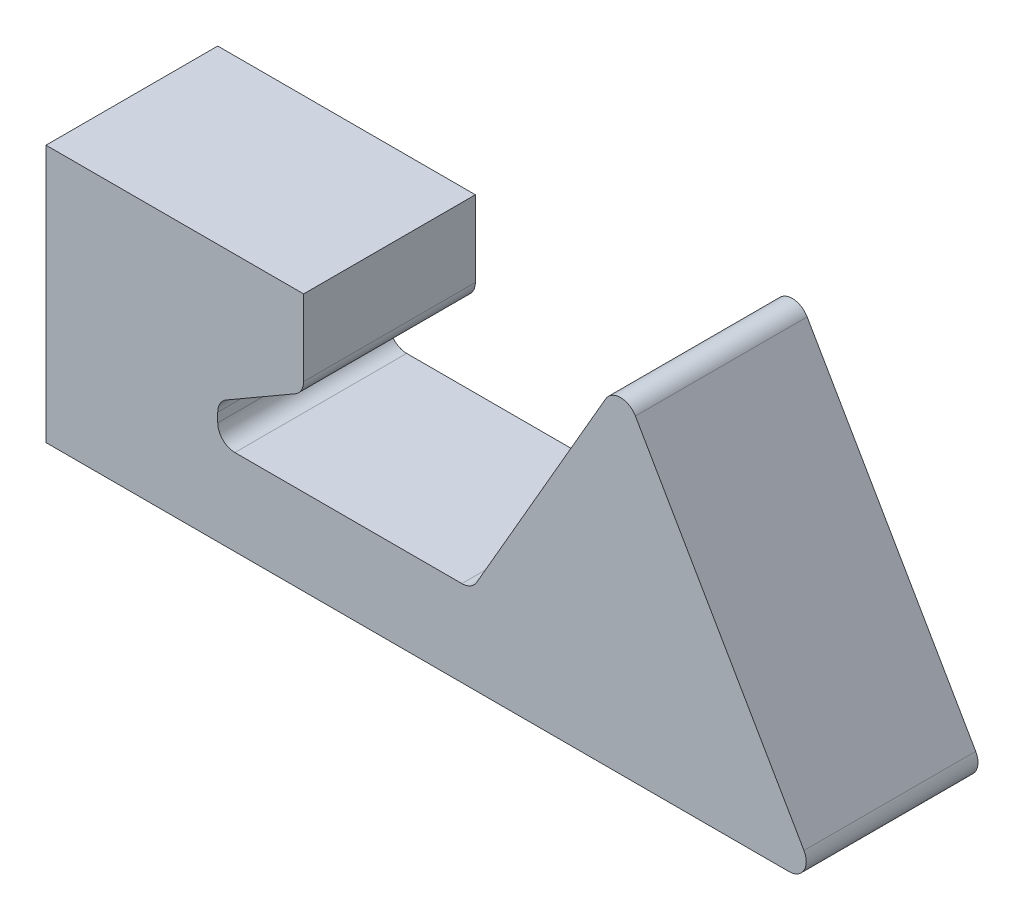
ISO-10303-21;
HEADER;
FILE_DESCRIPTION(('STEP AP214'),'2;1');
FILE_NAME('part.step','',(''),(''),'','','');
FILE_SCHEMA(('AUTOMOTIVE_DESIGN { 1 0 10303 214 1 1 1 1 }'));
ENDSEC;
DATA;
#1=APPLICATION_CONTEXT('core data for automotive mechanical design processes');
#2=APPLICATION_PROTOCOL_DEFINITION('international standard','automotive_design',2000,#1);
#3=PRODUCT_CONTEXT('',#1,'mechanical');
#4=PRODUCT('Part','Part','',(#3));
#5=PRODUCT_RELATED_PRODUCT_CATEGORY('part','',(#4));
#6=PRODUCT_DEFINITION_FORMATION('','',#4);
#7=PRODUCT_DEFINITION_CONTEXT('part definition',#1,'design');
#8=PRODUCT_DEFINITION('design','',#6,#7);
#9=PRODUCT_DEFINITION_SHAPE('','',#8);
#10=(LENGTH_UNIT() NAMED_UNIT(*) SI_UNIT(.MILLI.,.METRE.));
#11=(NAMED_UNIT(*) PLANE_ANGLE_UNIT() SI_UNIT($,.RADIAN.));
#12=(NAMED_UNIT(*) SI_UNIT($,.STERADIAN.) SOLID_ANGLE_UNIT());
#13=UNCERTAINTY_MEASURE_WITH_UNIT(LENGTH_MEASURE(1.E-05),#10,'distance_accuracy_value','');
#14=(GEOMETRIC_REPRESENTATION_CONTEXT(3) GLOBAL_UNCERTAINTY_ASSIGNED_CONTEXT((#13)) GLOBAL_UNIT_ASSIGNED_CONTEXT((#10,
#11,#12)) REPRESENTATION_CONTEXT('',''));
#15=CARTESIAN_POINT('',(0.,0.,0.));
#16=DIRECTION('',(0.,0.,1.));
#17=DIRECTION('',(1.,0.,0.));
#18=AXIS2_PLACEMENT_3D('',#15,#16,#17);
#19=CARTESIAN_POINT('',(0.,30.,20.));
#20=DIRECTION('',(1.,0.,0.));
#21=DIRECTION('',(0.,1.,0.));
#22=AXIS2_PLACEMENT_3D('',#19,#20,#21);
#23=PLANE('',#22);
#24=DIRECTION('',(0.,-1.,0.));
#25=VECTOR('',#24,1.);
#26=CARTESIAN_POINT('',(0.,30.,0.));
#27=LINE('',#26,#25);
#28=CARTESIAN_POINT('',(0.,30.,0.));
#29=VERTEX_POINT('',#28);
#30=CARTESIAN_POINT('',(0.,0.,0.));
#31=VERTEX_POINT('',#30);
#32=EDGE_CURVE('E174',#29,#31,#27,.T.);
#33=ORIENTED_EDGE('',*,*,#32,.T.);
#34=DIRECTION('',(0.,0.,-1.));
#35=VECTOR('',#34,1.);
#36=CARTESIAN_POINT('',(0.,0.,20.));
#37=LINE('',#36,#35);
#38=CARTESIAN_POINT('',(0.,0.,20.));
#39=VERTEX_POINT('',#38);
#40=EDGE_CURVE('E153',#39,#31,#37,.T.);
#41=ORIENTED_EDGE('',*,*,#40,.F.);
#42=DIRECTION('',(0.,-1.,0.));
#43=VECTOR('',#42,1.);
#44=CARTESIAN_POINT('',(0.,30.,20.));
#45=LINE('',#44,#43);
#46=CARTESIAN_POINT('',(0.,30.,20.));
#47=VERTEX_POINT('',#46);
#48=EDGE_CURVE('E160',#47,#39,#45,.T.);
#49=ORIENTED_EDGE('',*,*,#48,.F.);
#50=DIRECTION('',(0.,0.,-1.));
#51=VECTOR('',#50,1.);
#52=CARTESIAN_POINT('',(0.,30.,20.));
#53=LINE('',#52,#51);
#54=EDGE_CURVE('E185',#47,#29,#53,.T.);
#55=ORIENTED_EDGE('',*,*,#54,.T.);
#56=EDGE_LOOP('',(#33,#41,#49,#55));
#57=FACE_BOUND('',#56,.T.);
#58=ADVANCED_FACE('F39',(#57),#23,.F.);
#59=CARTESIAN_POINT('',(0.,0.,20.));
#60=DIRECTION('',(0.,1.,0.));
#61=DIRECTION('',(0.,0.,1.));
#62=AXIS2_PLACEMENT_3D('',#59,#60,#61);
#63=PLANE('',#62);
#64=DIRECTION('',(1.,0.,0.));
#65=VECTOR('',#64,1.);
#66=CARTESIAN_POINT('',(0.,0.,0.));
#67=LINE('',#66,#65);
#68=CARTESIAN_POINT('',(86.5358983848622,0.,0.));
#69=VERTEX_POINT('',#68);
#70=EDGE_CURVE('E300',#31,#69,#67,.T.);
#71=ORIENTED_EDGE('',*,*,#70,.T.);
#72=DIRECTION('',(0.,0.,-1.));
#73=VECTOR('',#72,1.);
#74=CARTESIAN_POINT('',(86.5358983848622,0.,20.));
#75=LINE('',#74,#73);
#76=CARTESIAN_POINT('',(86.5358983848622,0.,20.));
#77=VERTEX_POINT('',#76);
#78=EDGE_CURVE('E156',#69,#77,#75,.F.);
#79=ORIENTED_EDGE('',*,*,#78,.T.);
#80=DIRECTION('',(1.,0.,0.));
#81=VECTOR('',#80,1.);
#82=CARTESIAN_POINT('',(0.,0.,20.));
#83=LINE('',#82,#81);
#84=EDGE_CURVE('E148',#39,#77,#83,.T.);
#85=ORIENTED_EDGE('',*,*,#84,.F.);
#86=ORIENTED_EDGE('',*,*,#40,.T.);
#87=EDGE_LOOP('',(#71,#79,#85,#86));
#88=FACE_BOUND('',#87,.T.);
#89=ADVANCED_FACE('F151',(#88),#63,.F.);
#90=CARTESIAN_POINT('',(90.,0.,20.));
#91=DIRECTION('',(-0.866025403784436,-0.500000000000004,0.));
#92=DIRECTION('',(0.500000000000004,-0.866025403784436,0.));
#93=AXIS2_PLACEMENT_3D('',#90,#91,#92);
#94=PLANE('',#93);
#95=DIRECTION('',(-0.500000000000004,0.866025403784436,0.));
#96=VECTOR('',#95,1.);
#97=CARTESIAN_POINT('',(90.,0.,0.));
#98=LINE('',#97,#96);
#99=CARTESIAN_POINT('',(88.2679491924311,3.,0.));
#100=VERTEX_POINT('',#99);
#101=CARTESIAN_POINT('',(68.6380400399836,37.,0.));
#102=VERTEX_POINT('',#101);
#103=EDGE_CURVE('E271',#100,#102,#98,.T.);
#104=ORIENTED_EDGE('',*,*,#103,.T.);
#105=DIRECTION('',(0.,0.,-1.));
#106=VECTOR('',#105,1.);
#107=CARTESIAN_POINT('',(68.6380400399836,37.,20.));
#108=LINE('',#107,#106);
#109=CARTESIAN_POINT('',(68.6380400399836,37.,20.));
#110=VERTEX_POINT('',#109);
#111=EDGE_CURVE('E237',#102,#110,#108,.F.);
#112=ORIENTED_EDGE('',*,*,#111,.T.);
#113=DIRECTION('',(-0.500000000000004,0.866025403784436,0.));
#114=VECTOR('',#113,1.);
#115=CARTESIAN_POINT('',(90.,0.,20.));
#116=LINE('',#115,#114);
#117=CARTESIAN_POINT('',(88.2679491924311,3.,20.));
#118=VERTEX_POINT('',#117);
#119=EDGE_CURVE('E159',#118,#110,#116,.T.);
#120=ORIENTED_EDGE('',*,*,#119,.F.);
#121=DIRECTION('',(0.,0.,-1.));
#122=VECTOR('',#121,1.);
#123=CARTESIAN_POINT('',(88.2679491924311,3.00000000000001,20.));
#124=LINE('',#123,#122);
#125=EDGE_CURVE('E233',#118,#100,#124,.T.);
#126=ORIENTED_EDGE('',*,*,#125,.T.);
#127=EDGE_LOOP('',(#104,#112,#120,#126));
#128=FACE_BOUND('',#127,.T.);
#129=ADVANCED_FACE('F329',(#128),#94,.F.);
#130=CARTESIAN_POINT('',(66.9059892324147,40.,20.));
#131=DIRECTION('',(0.86602540378444,-0.499999999999998,0.));
#132=DIRECTION('',(0.499999999999998,0.86602540378444,0.));
#133=AXIS2_PLACEMENT_3D('',#130,#131,#132);
#134=PLANE('',#133);
#135=DIRECTION('',(-0.499999999999998,-0.86602540378444,0.));
#136=VECTOR('',#135,1.);
#137=CARTESIAN_POINT('',(66.9059892324147,40.,0.));
#138=LINE('',#137,#136);
#139=CARTESIAN_POINT('',(65.1739384248458,37.,0.));
#140=VERTEX_POINT('',#139);
#141=CARTESIAN_POINT('',(50.1628314259157,11.,0.));
#142=VERTEX_POINT('',#141);
#143=EDGE_CURVE('E259',#140,#142,#138,.T.);
#144=ORIENTED_EDGE('',*,*,#143,.T.);
#145=DIRECTION('',(0.,0.,-1.));
#146=VECTOR('',#145,1.);
#147=CARTESIAN_POINT('',(50.1628314259157,11.,20.));
#148=LINE('',#147,#146);
#149=CARTESIAN_POINT('',(50.1628314259157,11.,20.));
#150=VERTEX_POINT('',#149);
#151=EDGE_CURVE('E230',#142,#150,#148,.F.);
#152=ORIENTED_EDGE('',*,*,#151,.T.);
#153=DIRECTION('',(-0.499999999999998,-0.86602540378444,0.));
#154=VECTOR('',#153,1.);
#155=CARTESIAN_POINT('',(66.9059892324147,40.,20.));
#156=LINE('',#155,#154);
#157=CARTESIAN_POINT('',(65.1739384248458,37.,20.));
#158=VERTEX_POINT('',#157);
#159=EDGE_CURVE('E277',#158,#150,#156,.T.);
#160=ORIENTED_EDGE('',*,*,#159,.F.);
#161=DIRECTION('',(0.,0.,-1.));
#162=VECTOR('',#161,1.);
#163=CARTESIAN_POINT('',(65.1739384248458,37.,20.));
#164=LINE('',#163,#162);
#165=EDGE_CURVE('E226',#158,#140,#164,.T.);
#166=ORIENTED_EDGE('',*,*,#165,.T.);
#167=EDGE_LOOP('',(#144,#152,#160,#166));
#168=FACE_BOUND('',#167,.T.);
#169=ADVANCED_FACE('F266',(#168),#134,.F.);
#170=CARTESIAN_POINT('',(49.585481156726,10.,20.));
#171=DIRECTION('',(0.,-1.,0.));
#172=DIRECTION('',(1.,0.,0.));
#173=AXIS2_PLACEMENT_3D('',#170,#171,#172);
#174=PLANE('',#173);
#175=DIRECTION('',(-1.,0.,0.));
#176=VECTOR('',#175,1.);
#177=CARTESIAN_POINT('',(49.585481156726,10.,0.));
#178=LINE('',#177,#176);
#179=CARTESIAN_POINT('',(48.4307806183468,10.,0.));
#180=VERTEX_POINT('',#179);
#181=CARTESIAN_POINT('',(22.,10.,0.));
#182=VERTEX_POINT('',#181);
#183=EDGE_CURVE('E261',#180,#182,#178,.T.);
#184=ORIENTED_EDGE('',*,*,#183,.T.);
#185=DIRECTION('',(0.,0.,-1.));
#186=VECTOR('',#185,1.);
#187=CARTESIAN_POINT('',(22.,10.,20.));
#188=LINE('',#187,#186);
#189=CARTESIAN_POINT('',(22.,10.,20.));
#190=VERTEX_POINT('',#189);
#191=EDGE_CURVE('E223',#182,#190,#188,.F.);
#192=ORIENTED_EDGE('',*,*,#191,.T.);
#193=DIRECTION('',(-1.,0.,0.));
#194=VECTOR('',#193,1.);
#195=CARTESIAN_POINT('',(49.585481156726,10.,20.));
#196=LINE('',#195,#194);
#197=CARTESIAN_POINT('',(48.4307806183468,10.,20.));
#198=VERTEX_POINT('',#197);
#199=EDGE_CURVE('E276',#198,#190,#196,.T.);
#200=ORIENTED_EDGE('',*,*,#199,.F.);
#201=DIRECTION('',(0.,0.,-1.));
#202=VECTOR('',#201,1.);
#203=CARTESIAN_POINT('',(48.4307806183468,10.,0.));
#204=LINE('',#203,#202);
#205=EDGE_CURVE('E219',#198,#180,#204,.T.);
#206=ORIENTED_EDGE('',*,*,#205,.T.);
#207=EDGE_LOOP('',(#184,#192,#200,#206));
#208=FACE_BOUND('',#207,.T.);
#209=ADVANCED_FACE('F279',(#208),#174,.F.);
#210=CARTESIAN_POINT('',(20.,10.,20.));
#211=DIRECTION('',(-1.,0.,0.));
#212=DIRECTION('',(0.,0.,1.));
#213=AXIS2_PLACEMENT_3D('',#210,#211,#212);
#214=PLANE('',#213);
#215=DIRECTION('',(0.,1.,0.));
#216=VECTOR('',#215,1.);
#217=CARTESIAN_POINT('',(20.,10.,0.));
#218=LINE('',#217,#216);
#219=CARTESIAN_POINT('',(20.,12.,0.));
#220=VERTEX_POINT('',#219);
#221=CARTESIAN_POINT('',(20.,13.0717967697244,0.));
#222=VERTEX_POINT('',#221);
#223=EDGE_CURVE('E308',#220,#222,#218,.T.);
#224=ORIENTED_EDGE('',*,*,#223,.T.);
#225=DIRECTION('',(0.,0.,-1.));
#226=VECTOR('',#225,1.);
#227=CARTESIAN_POINT('',(20.,13.0717967697244,20.));
#228=LINE('',#227,#226);
#229=CARTESIAN_POINT('',(20.,13.0717967697244,20.));
#230=VERTEX_POINT('',#229);
#231=EDGE_CURVE('E55',#222,#230,#228,.F.);
#232=ORIENTED_EDGE('',*,*,#231,.T.);
#233=DIRECTION('',(0.,1.,0.));
#234=VECTOR('',#233,1.);
#235=CARTESIAN_POINT('',(20.,10.,20.));
#236=LINE('',#235,#234);
#237=CARTESIAN_POINT('',(20.,12.,20.));
#238=VERTEX_POINT('',#237);
#239=EDGE_CURVE('E282',#238,#230,#236,.T.);
#240=ORIENTED_EDGE('',*,*,#239,.F.);
#241=DIRECTION('',(0.,0.,-1.));
#242=VECTOR('',#241,1.);
#243=CARTESIAN_POINT('',(20.,12.,0.));
#244=LINE('',#243,#242);
#245=EDGE_CURVE('E213',#238,#220,#244,.T.);
#246=ORIENTED_EDGE('',*,*,#245,.T.);
#247=EDGE_LOOP('',(#224,#232,#240,#246));
#248=FACE_BOUND('',#247,.T.);
#249=ADVANCED_FACE('F363',(#248),#214,.F.);
#250=CARTESIAN_POINT('',(20.,14.2264973081037,20.));
#251=DIRECTION('',(-0.500000000000004,0.866025403784436,0.));
#252=DIRECTION('',(-0.866025403784436,-0.500000000000004,0.));
#253=AXIS2_PLACEMENT_3D('',#250,#251,#252);
#254=PLANE('',#253);
#255=DIRECTION('',(0.866025403784436,0.500000000000004,0.));
#256=VECTOR('',#255,1.);
#257=CARTESIAN_POINT('',(20.,14.2264973081037,0.));
#258=LINE('',#257,#256);
#259=CARTESIAN_POINT('',(21.,14.8038475772933,0.));
#260=VERTEX_POINT('',#259);
#261=CARTESIAN_POINT('',(29.,19.4226497308104,0.));
#262=VERTEX_POINT('',#261);
#263=EDGE_CURVE('E311',#260,#262,#258,.T.);
#264=ORIENTED_EDGE('',*,*,#263,.T.);
#265=DIRECTION('',(0.,0.,-1.));
#266=VECTOR('',#265,1.);
#267=CARTESIAN_POINT('',(29.,19.4226497308104,20.));
#268=LINE('',#267,#266);
#269=CARTESIAN_POINT('',(29.,19.4226497308104,20.));
#270=VERTEX_POINT('',#269);
#271=EDGE_CURVE('E201',#262,#270,#268,.F.);
#272=ORIENTED_EDGE('',*,*,#271,.T.);
#273=DIRECTION('',(0.866025403784436,0.500000000000004,0.));
#274=VECTOR('',#273,1.);
#275=CARTESIAN_POINT('',(20.,14.2264973081037,20.));
#276=LINE('',#275,#274);
#277=CARTESIAN_POINT('',(21.,14.8038475772933,20.));
#278=VERTEX_POINT('',#277);
#279=EDGE_CURVE('E286',#278,#270,#276,.T.);
#280=ORIENTED_EDGE('',*,*,#279,.F.);
#281=DIRECTION('',(0.,0.,-1.));
#282=VECTOR('',#281,1.);
#283=CARTESIAN_POINT('',(21.,14.8038475772933,0.));
#284=LINE('',#283,#282);
#285=EDGE_CURVE('E197',#278,#260,#284,.T.);
#286=ORIENTED_EDGE('',*,*,#285,.T.);
#287=EDGE_LOOP('',(#264,#272,#280,#286));
#288=FACE_BOUND('',#287,.T.);
#289=ADVANCED_FACE('F369',(#288),#254,.F.);
#290=CARTESIAN_POINT('',(30.,20.,20.));
#291=DIRECTION('',(-1.,0.,0.));
#292=DIRECTION('',(0.,0.,1.));
#293=AXIS2_PLACEMENT_3D('',#290,#291,#292);
#294=PLANE('',#293);
#295=DIRECTION('',(0.,1.,0.));
#296=VECTOR('',#295,1.);
#297=CARTESIAN_POINT('',(30.,20.,20.));
#298=LINE('',#297,#296);
#299=CARTESIAN_POINT('',(30.,21.1547005383792,20.));
#300=VERTEX_POINT('',#299);
#301=CARTESIAN_POINT('',(30.,30.,20.));
#302=VERTEX_POINT('',#301);
#303=EDGE_CURVE('E293',#300,#302,#298,.T.);
#304=ORIENTED_EDGE('',*,*,#303,.F.);
#305=DIRECTION('',(0.,0.,-1.));
#306=VECTOR('',#305,1.);
#307=CARTESIAN_POINT('',(30.,21.1547005383792,20.));
#308=LINE('',#307,#306);
#309=CARTESIAN_POINT('',(30.,21.1547005383792,0.));
#310=VERTEX_POINT('',#309);
#311=EDGE_CURVE('E176',#300,#310,#308,.T.);
#312=ORIENTED_EDGE('',*,*,#311,.T.);
#313=DIRECTION('',(0.,1.,0.));
#314=VECTOR('',#313,1.);
#315=CARTESIAN_POINT('',(30.,20.,0.));
#316=LINE('',#315,#314);
#317=CARTESIAN_POINT('',(30.,30.,0.));
#318=VERTEX_POINT('',#317);
#319=EDGE_CURVE('E315',#310,#318,#316,.T.);
#320=ORIENTED_EDGE('',*,*,#319,.T.);
#321=DIRECTION('',(0.,0.,-1.));
#322=VECTOR('',#321,1.);
#323=CARTESIAN_POINT('',(30.,30.,20.));
#324=LINE('',#323,#322);
#325=EDGE_CURVE('E177',#302,#318,#324,.T.);
#326=ORIENTED_EDGE('',*,*,#325,.F.);
#327=EDGE_LOOP('',(#304,#312,#320,#326));
#328=FACE_BOUND('',#327,.T.);
#329=ADVANCED_FACE('F375',(#328),#294,.F.);
#330=CARTESIAN_POINT('',(30.,30.,20.));
#331=DIRECTION('',(0.,-1.,0.));
#332=DIRECTION('',(1.,0.,0.));
#333=AXIS2_PLACEMENT_3D('',#330,#331,#332);
#334=PLANE('',#333);
#335=DIRECTION('',(-1.,0.,0.));
#336=VECTOR('',#335,1.);
#337=CARTESIAN_POINT('',(30.,30.,0.));
#338=LINE('',#337,#336);
#339=EDGE_CURVE('E171',#318,#29,#338,.T.);
#340=ORIENTED_EDGE('',*,*,#339,.T.);
#341=ORIENTED_EDGE('',*,*,#54,.F.);
#342=DIRECTION('',(-1.,0.,0.));
#343=VECTOR('',#342,1.);
#344=CARTESIAN_POINT('',(30.,30.,20.));
#345=LINE('',#344,#343);
#346=EDGE_CURVE('E166',#302,#47,#345,.T.);
#347=ORIENTED_EDGE('',*,*,#346,.F.);
#348=ORIENTED_EDGE('',*,*,#325,.T.);
#349=EDGE_LOOP('',(#340,#341,#347,#348));
#350=FACE_BOUND('',#349,.T.);
#351=ADVANCED_FACE('F377',(#350),#334,.F.);
#352=CARTESIAN_POINT('',(0.,0.,20.));
#353=DIRECTION('',(0.,0.,1.));
#354=DIRECTION('',(1.,0.,0.));
#355=AXIS2_PLACEMENT_3D('',#352,#353,#354);
#356=PLANE('',#355);
#357=ORIENTED_EDGE('',*,*,#279,.T.);
#358=CARTESIAN_POINT('',(28.,21.1547005383792,20.));
#359=DIRECTION('',(0.,0.,1.));
#360=DIRECTION('',(1.,0.,0.));
#361=AXIS2_PLACEMENT_3D('',#358,#359,#360);
#362=CIRCLE('',#361,2.);
#363=EDGE_CURVE('E210',#270,#300,#362,.T.);
#364=ORIENTED_EDGE('',*,*,#363,.T.);
#365=ORIENTED_EDGE('',*,*,#303,.T.);
#366=ORIENTED_EDGE('',*,*,#346,.T.);
#367=ORIENTED_EDGE('',*,*,#48,.T.);
#368=ORIENTED_EDGE('',*,*,#84,.T.);
#369=CARTESIAN_POINT('',(86.5358983848622,2.,20.));
#370=DIRECTION('',(0.,0.,1.));
#371=DIRECTION('',(1.,0.,0.));
#372=AXIS2_PLACEMENT_3D('',#369,#370,#371);
#373=CIRCLE('',#372,2.);
#374=EDGE_CURVE('E204',#77,#118,#373,.T.);
#375=ORIENTED_EDGE('',*,*,#374,.T.);
#376=ORIENTED_EDGE('',*,*,#119,.T.);
#377=CARTESIAN_POINT('',(66.9059892324147,36.,20.));
#378=DIRECTION('',(0.,0.,1.));
#379=DIRECTION('',(1.,0.,0.));
#380=AXIS2_PLACEMENT_3D('',#377,#378,#379);
#381=CIRCLE('',#380,2.);
#382=EDGE_CURVE('E207',#110,#158,#381,.T.);
#383=ORIENTED_EDGE('',*,*,#382,.T.);
#384=ORIENTED_EDGE('',*,*,#159,.T.);
#385=CARTESIAN_POINT('',(48.4307806183468,12.,20.));
#386=DIRECTION('',(0.,0.,1.));
#387=DIRECTION('',(1.,0.,0.));
#388=AXIS2_PLACEMENT_3D('',#385,#386,#387);
#389=CIRCLE('',#388,2.);
#390=EDGE_CURVE('E11',#150,#198,#389,.F.);
#391=ORIENTED_EDGE('',*,*,#390,.T.);
#392=ORIENTED_EDGE('',*,*,#199,.T.);
#393=CARTESIAN_POINT('',(22.,12.,20.));
#394=DIRECTION('',(0.,0.,1.));
#395=DIRECTION('',(1.,0.,0.));
#396=AXIS2_PLACEMENT_3D('',#393,#394,#395);
#397=CIRCLE('',#396,2.);
#398=EDGE_CURVE('E62',#190,#238,#397,.F.);
#399=ORIENTED_EDGE('',*,*,#398,.T.);
#400=ORIENTED_EDGE('',*,*,#239,.T.);
#401=CARTESIAN_POINT('',(22.,13.0717967697244,20.));
#402=DIRECTION('',(0.,0.,1.));
#403=DIRECTION('',(1.,0.,0.));
#404=AXIS2_PLACEMENT_3D('',#401,#402,#403);
#405=CIRCLE('',#404,2.);
#406=EDGE_CURVE('E245',#230,#278,#405,.F.);
#407=ORIENTED_EDGE('',*,*,#406,.T.);
#408=EDGE_LOOP('',(#357,#364,#365,#366,#367,#368,#375,#376,#383,#384,#391,#392,#399,#400,#407));
#409=FACE_BOUND('',#408,.T.);
#410=ADVANCED_FACE('F164',(#409),#356,.T.);
#411=CARTESIAN_POINT('',(0.,0.,0.));
#412=DIRECTION('',(0.,0.,1.));
#413=DIRECTION('',(1.,0.,0.));
#414=AXIS2_PLACEMENT_3D('',#411,#412,#413);
#415=PLANE('',#414);
#416=ORIENTED_EDGE('',*,*,#319,.F.);
#417=CARTESIAN_POINT('',(28.,21.1547005383792,0.));
#418=DIRECTION('',(0.,0.,1.));
#419=DIRECTION('',(1.,0.,0.));
#420=AXIS2_PLACEMENT_3D('',#417,#418,#419);
#421=CIRCLE('',#420,2.);
#422=EDGE_CURVE('E194',#310,#262,#421,.F.);
#423=ORIENTED_EDGE('',*,*,#422,.T.);
#424=ORIENTED_EDGE('',*,*,#263,.F.);
#425=CARTESIAN_POINT('',(22.,13.0717967697244,0.));
#426=DIRECTION('',(0.,0.,1.));
#427=DIRECTION('',(1.,0.,0.));
#428=AXIS2_PLACEMENT_3D('',#425,#426,#427);
#429=CIRCLE('',#428,2.);
#430=EDGE_CURVE('E242',#260,#222,#429,.T.);
#431=ORIENTED_EDGE('',*,*,#430,.T.);
#432=ORIENTED_EDGE('',*,*,#223,.F.);
#433=CARTESIAN_POINT('',(22.,12.,0.));
#434=DIRECTION('',(0.,0.,1.));
#435=DIRECTION('',(1.,0.,0.));
#436=AXIS2_PLACEMENT_3D('',#433,#434,#435);
#437=CIRCLE('',#436,2.);
#438=EDGE_CURVE('E248',#220,#182,#437,.T.);
#439=ORIENTED_EDGE('',*,*,#438,.T.);
#440=ORIENTED_EDGE('',*,*,#183,.F.);
#441=CARTESIAN_POINT('',(48.4307806183468,12.,0.));
#442=DIRECTION('',(0.,0.,1.));
#443=DIRECTION('',(1.,0.,0.));
#444=AXIS2_PLACEMENT_3D('',#441,#442,#443);
#445=CIRCLE('',#444,2.);
#446=EDGE_CURVE('E48',#180,#142,#445,.T.);
#447=ORIENTED_EDGE('',*,*,#446,.T.);
#448=ORIENTED_EDGE('',*,*,#143,.F.);
#449=CARTESIAN_POINT('',(66.9059892324147,36.,0.));
#450=DIRECTION('',(0.,0.,1.));
#451=DIRECTION('',(1.,0.,0.));
#452=AXIS2_PLACEMENT_3D('',#449,#450,#451);
#453=CIRCLE('',#452,2.);
#454=EDGE_CURVE('E191',#140,#102,#453,.F.);
#455=ORIENTED_EDGE('',*,*,#454,.T.);
#456=ORIENTED_EDGE('',*,*,#103,.F.);
#457=CARTESIAN_POINT('',(86.5358983848622,2.,0.));
#458=DIRECTION('',(0.,0.,1.));
#459=DIRECTION('',(1.,0.,0.));
#460=AXIS2_PLACEMENT_3D('',#457,#458,#459);
#461=CIRCLE('',#460,2.);
#462=EDGE_CURVE('E182',#100,#69,#461,.F.);
#463=ORIENTED_EDGE('',*,*,#462,.T.);
#464=ORIENTED_EDGE('',*,*,#70,.F.);
#465=ORIENTED_EDGE('',*,*,#32,.F.);
#466=ORIENTED_EDGE('',*,*,#339,.F.);
#467=EDGE_LOOP('',(#416,#423,#424,#431,#432,#439,#440,#447,#448,#455,#456,#463,#464,#465,#466));
#468=FACE_BOUND('',#467,.T.);
#469=ADVANCED_FACE('F258',(#468),#415,.F.);
#470=CARTESIAN_POINT('',(28.,21.1547005383792,20.));
#471=DIRECTION('',(0.,0.,-1.));
#472=DIRECTION('',(-1.,0.,0.));
#473=AXIS2_PLACEMENT_3D('',#470,#471,#472);
#474=CYLINDRICAL_SURFACE('',#473,2.);
#475=ORIENTED_EDGE('',*,*,#363,.F.);
#476=ORIENTED_EDGE('',*,*,#271,.F.);
#477=ORIENTED_EDGE('',*,*,#422,.F.);
#478=ORIENTED_EDGE('',*,*,#311,.F.);
#479=EDGE_LOOP('',(#475,#476,#477,#478));
#480=FACE_BOUND('',#479,.T.);
#481=ADVANCED_FACE('F349',(#480),#474,.T.);
#482=CARTESIAN_POINT('',(22.,13.0717967697244,20.));
#483=DIRECTION('',(0.,0.,1.));
#484=DIRECTION('',(1.,0.,0.));
#485=AXIS2_PLACEMENT_3D('',#482,#483,#484);
#486=CYLINDRICAL_SURFACE('',#485,2.);
#487=ORIENTED_EDGE('',*,*,#406,.F.);
#488=ORIENTED_EDGE('',*,*,#231,.F.);
#489=ORIENTED_EDGE('',*,*,#430,.F.);
#490=ORIENTED_EDGE('',*,*,#285,.F.);
#491=EDGE_LOOP('',(#487,#488,#489,#490));
#492=FACE_BOUND('',#491,.T.);
#493=ADVANCED_FACE('F352',(#492),#486,.F.);
#494=CARTESIAN_POINT('',(22.,12.,20.));
#495=DIRECTION('',(0.,0.,1.));
#496=DIRECTION('',(1.,0.,0.));
#497=AXIS2_PLACEMENT_3D('',#494,#495,#496);
#498=CYLINDRICAL_SURFACE('',#497,2.);
#499=ORIENTED_EDGE('',*,*,#398,.F.);
#500=ORIENTED_EDGE('',*,*,#191,.F.);
#501=ORIENTED_EDGE('',*,*,#438,.F.);
#502=ORIENTED_EDGE('',*,*,#245,.F.);
#503=EDGE_LOOP('',(#499,#500,#501,#502));
#504=FACE_BOUND('',#503,.T.);
#505=ADVANCED_FACE('F339',(#504),#498,.F.);
#506=CARTESIAN_POINT('',(48.4307806183468,12.,20.));
#507=DIRECTION('',(0.,0.,1.));
#508=DIRECTION('',(1.,0.,0.));
#509=AXIS2_PLACEMENT_3D('',#506,#507,#508);
#510=CYLINDRICAL_SURFACE('',#509,2.);
#511=ORIENTED_EDGE('',*,*,#390,.F.);
#512=ORIENTED_EDGE('',*,*,#151,.F.);
#513=ORIENTED_EDGE('',*,*,#446,.F.);
#514=ORIENTED_EDGE('',*,*,#205,.F.);
#515=EDGE_LOOP('',(#511,#512,#513,#514));
#516=FACE_BOUND('',#515,.T.);
#517=ADVANCED_FACE('F274',(#516),#510,.F.);
#518=CARTESIAN_POINT('',(66.9059892324147,36.,20.));
#519=DIRECTION('',(0.,0.,-1.));
#520=DIRECTION('',(-1.,0.,0.));
#521=AXIS2_PLACEMENT_3D('',#518,#519,#520);
#522=CYLINDRICAL_SURFACE('',#521,2.);
#523=ORIENTED_EDGE('',*,*,#382,.F.);
#524=ORIENTED_EDGE('',*,*,#111,.F.);
#525=ORIENTED_EDGE('',*,*,#454,.F.);
#526=ORIENTED_EDGE('',*,*,#165,.F.);
#527=EDGE_LOOP('',(#523,#524,#525,#526));
#528=FACE_BOUND('',#527,.T.);
#529=ADVANCED_FACE('F333',(#528),#522,.T.);
#530=CARTESIAN_POINT('',(86.5358983848622,2.,20.));
#531=DIRECTION('',(0.,0.,-1.));
#532=DIRECTION('',(-1.,0.,0.));
#533=AXIS2_PLACEMENT_3D('',#530,#531,#532);
#534=CYLINDRICAL_SURFACE('',#533,2.);
#535=ORIENTED_EDGE('',*,*,#374,.F.);
#536=ORIENTED_EDGE('',*,*,#78,.F.);
#537=ORIENTED_EDGE('',*,*,#462,.F.);
#538=ORIENTED_EDGE('',*,*,#125,.F.);
#539=EDGE_LOOP('',(#535,#536,#537,#538));
#540=FACE_BOUND('',#539,.T.);
#541=ADVANCED_FACE('F41',(#540),#534,.T.);
#542=CLOSED_SHELL('',(#58,#89,#129,#169,#209,#249,#289,#329,#351,#410,#469,#481,#493,#505,#517,
#529,#541));
#543=MANIFOLD_SOLID_BREP('B2',#542);
#544=ADVANCED_BREP_SHAPE_REPRESENTATION('',(#18,#543),#14);
#545=SHAPE_DEFINITION_REPRESENTATION(#9,#544);
ENDSEC;
END-ISO-10303-21;
